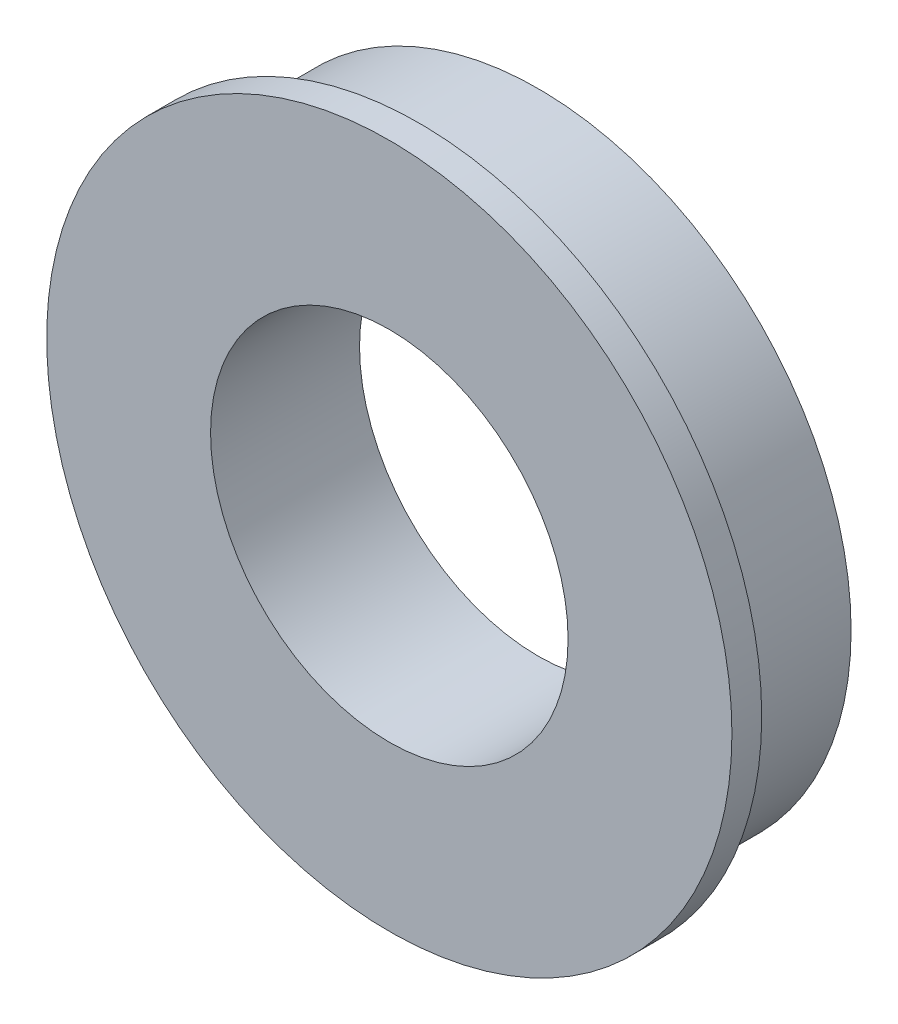
ISO-10303-21;
HEADER;
FILE_DESCRIPTION(('STEP AP214'),'2;1');
FILE_NAME('part.step','',(''),(''),'','','');
FILE_SCHEMA(('AUTOMOTIVE_DESIGN { 1 0 10303 214 1 1 1 1 }'));
ENDSEC;
DATA;
#1=APPLICATION_CONTEXT('core data for automotive mechanical design processes');
#2=APPLICATION_PROTOCOL_DEFINITION('international standard','automotive_design',2000,#1);
#3=PRODUCT_CONTEXT('',#1,'mechanical');
#4=PRODUCT('Part','Part','',(#3));
#5=PRODUCT_RELATED_PRODUCT_CATEGORY('part','',(#4));
#6=PRODUCT_DEFINITION_FORMATION('','',#4);
#7=PRODUCT_DEFINITION_CONTEXT('part definition',#1,'design');
#8=PRODUCT_DEFINITION('design','',#6,#7);
#9=PRODUCT_DEFINITION_SHAPE('','',#8);
#10=(LENGTH_UNIT() NAMED_UNIT(*) SI_UNIT(.MILLI.,.METRE.));
#11=(NAMED_UNIT(*) PLANE_ANGLE_UNIT() SI_UNIT($,.RADIAN.));
#12=(NAMED_UNIT(*) SI_UNIT($,.STERADIAN.) SOLID_ANGLE_UNIT());
#13=UNCERTAINTY_MEASURE_WITH_UNIT(LENGTH_MEASURE(1.E-05),#10,'distance_accuracy_value','');
#14=(GEOMETRIC_REPRESENTATION_CONTEXT(3) GLOBAL_UNCERTAINTY_ASSIGNED_CONTEXT((#13)) GLOBAL_UNIT_ASSIGNED_CONTEXT((#10,
#11,#12)) REPRESENTATION_CONTEXT('',''));
#15=CARTESIAN_POINT('',(0.,0.,0.));
#16=DIRECTION('',(0.,0.,1.));
#17=DIRECTION('',(1.,0.,0.));
#18=AXIS2_PLACEMENT_3D('',#15,#16,#17);
#19=CARTESIAN_POINT('',(0.,0.,0.));
#20=DIRECTION('',(0.,0.,1.));
#21=DIRECTION('',(1.,0.,0.));
#22=AXIS2_PLACEMENT_3D('',#19,#20,#21);
#23=PLANE('',#22);
#24=CARTESIAN_POINT('',(0.,0.,0.));
#25=DIRECTION('',(0.,0.,1.));
#26=DIRECTION('',(1.,0.,0.));
#27=AXIS2_PLACEMENT_3D('',#24,#25,#26);
#28=CIRCLE('',#27,10.5);
#29=CARTESIAN_POINT('',(10.5,0.,0.));
#30=VERTEX_POINT('',#29);
#31=EDGE_CURVE('E36',#30,#30,#28,.T.);
#32=ORIENTED_EDGE('',*,*,#31,.F.);
#33=EDGE_LOOP('',(#32));
#34=FACE_BOUND('',#33,.T.);
#35=CARTESIAN_POINT('',(0.,0.,0.));
#36=DIRECTION('',(0.,0.,1.));
#37=DIRECTION('',(1.,0.,0.));
#38=AXIS2_PLACEMENT_3D('',#35,#36,#37);
#39=CIRCLE('',#38,6.);
#40=CARTESIAN_POINT('',(6.,0.,0.));
#41=VERTEX_POINT('',#40);
#42=EDGE_CURVE('E43',#41,#41,#39,.T.);
#43=ORIENTED_EDGE('',*,*,#42,.T.);
#44=EDGE_LOOP('',(#43));
#45=FACE_BOUND('',#44,.T.);
#46=ADVANCED_FACE('F32',(#34,#45),#23,.F.);
#47=CARTESIAN_POINT('',(0.,0.,4.));
#48=DIRECTION('',(0.,0.,-1.));
#49=DIRECTION('',(-1.,0.,0.));
#50=AXIS2_PLACEMENT_3D('',#47,#48,#49);
#51=CYLINDRICAL_SURFACE('',#50,10.5);
#52=CARTESIAN_POINT('',(0.,0.,4.));
#53=DIRECTION('',(0.,0.,1.));
#54=DIRECTION('',(1.,0.,0.));
#55=AXIS2_PLACEMENT_3D('',#52,#53,#54);
#56=CIRCLE('',#55,10.5);
#57=CARTESIAN_POINT('',(10.5,0.,4.));
#58=VERTEX_POINT('',#57);
#59=EDGE_CURVE('E10',#58,#58,#56,.T.);
#60=ORIENTED_EDGE('',*,*,#59,.F.);
#61=EDGE_LOOP('',(#60));
#62=FACE_BOUND('',#61,.T.);
#63=ORIENTED_EDGE('',*,*,#31,.T.);
#64=EDGE_LOOP('',(#63));
#65=FACE_BOUND('',#64,.T.);
#66=ADVANCED_FACE('F34',(#62,#65),#51,.T.);
#67=CARTESIAN_POINT('',(0.,0.,4.));
#68=DIRECTION('',(0.,0.,-1.));
#69=DIRECTION('',(-1.,0.,0.));
#70=AXIS2_PLACEMENT_3D('',#67,#68,#69);
#71=CYLINDRICAL_SURFACE('',#70,6.);
#72=ORIENTED_EDGE('',*,*,#42,.F.);
#73=EDGE_LOOP('',(#72));
#74=FACE_BOUND('',#73,.T.);
#75=CARTESIAN_POINT('',(0.,0.,5.));
#76=DIRECTION('',(0.,0.,1.));
#77=DIRECTION('',(1.,0.,0.));
#78=AXIS2_PLACEMENT_3D('',#75,#76,#77);
#79=CIRCLE('',#78,6.);
#80=CARTESIAN_POINT('',(6.,0.,5.));
#81=VERTEX_POINT('',#80);
#82=EDGE_CURVE('E51',#81,#81,#79,.T.);
#83=ORIENTED_EDGE('',*,*,#82,.T.);
#84=EDGE_LOOP('',(#83));
#85=FACE_BOUND('',#84,.T.);
#86=ADVANCED_FACE('F57',(#74,#85),#71,.F.);
#87=CARTESIAN_POINT('',(0.,0.,5.));
#88=DIRECTION('',(0.,0.,1.));
#89=DIRECTION('',(1.,0.,0.));
#90=AXIS2_PLACEMENT_3D('',#87,#88,#89);
#91=PLANE('',#90);
#92=CARTESIAN_POINT('',(0.,0.,5.));
#93=DIRECTION('',(0.,0.,1.));
#94=DIRECTION('',(1.,0.,0.));
#95=AXIS2_PLACEMENT_3D('',#92,#93,#94);
#96=CIRCLE('',#95,11.5);
#97=CARTESIAN_POINT('',(11.5,0.,5.));
#98=VERTEX_POINT('',#97);
#99=EDGE_CURVE('E47',#98,#98,#96,.T.);
#100=ORIENTED_EDGE('',*,*,#99,.T.);
#101=EDGE_LOOP('',(#100));
#102=FACE_BOUND('',#101,.T.);
#103=ORIENTED_EDGE('',*,*,#82,.F.);
#104=EDGE_LOOP('',(#103));
#105=FACE_BOUND('',#104,.T.);
#106=ADVANCED_FACE('F59',(#102,#105),#91,.T.);
#107=CARTESIAN_POINT('',(0.,0.,4.));
#108=DIRECTION('',(0.,0.,1.));
#109=DIRECTION('',(1.,0.,0.));
#110=AXIS2_PLACEMENT_3D('',#107,#108,#109);
#111=PLANE('',#110);
#112=ORIENTED_EDGE('',*,*,#59,.T.);
#113=EDGE_LOOP('',(#112));
#114=FACE_BOUND('',#113,.T.);
#115=CARTESIAN_POINT('',(0.,0.,4.));
#116=DIRECTION('',(0.,0.,1.));
#117=DIRECTION('',(1.,0.,0.));
#118=AXIS2_PLACEMENT_3D('',#115,#116,#117);
#119=CIRCLE('',#118,11.5);
#120=CARTESIAN_POINT('',(11.5,0.,4.));
#121=VERTEX_POINT('',#120);
#122=EDGE_CURVE('E48',#121,#121,#119,.T.);
#123=ORIENTED_EDGE('',*,*,#122,.F.);
#124=EDGE_LOOP('',(#123));
#125=FACE_BOUND('',#124,.T.);
#126=ADVANCED_FACE('F61',(#114,#125),#111,.F.);
#127=CARTESIAN_POINT('',(0.,0.,5.));
#128=DIRECTION('',(0.,0.,-1.));
#129=DIRECTION('',(-1.,0.,0.));
#130=AXIS2_PLACEMENT_3D('',#127,#128,#129);
#131=CYLINDRICAL_SURFACE('',#130,11.5);
#132=ORIENTED_EDGE('',*,*,#99,.F.);
#133=EDGE_LOOP('',(#132));
#134=FACE_BOUND('',#133,.T.);
#135=ORIENTED_EDGE('',*,*,#122,.T.);
#136=EDGE_LOOP('',(#135));
#137=FACE_BOUND('',#136,.T.);
#138=ADVANCED_FACE('F68',(#134,#137),#131,.T.);
#139=CLOSED_SHELL('',(#46,#66,#86,#106,#126,#138));
#140=MANIFOLD_SOLID_BREP('B2',#139);
#141=ADVANCED_BREP_SHAPE_REPRESENTATION('',(#18,#140),#14);
#142=SHAPE_DEFINITION_REPRESENTATION(#9,#141);
ENDSEC;
END-ISO-10303-21;
